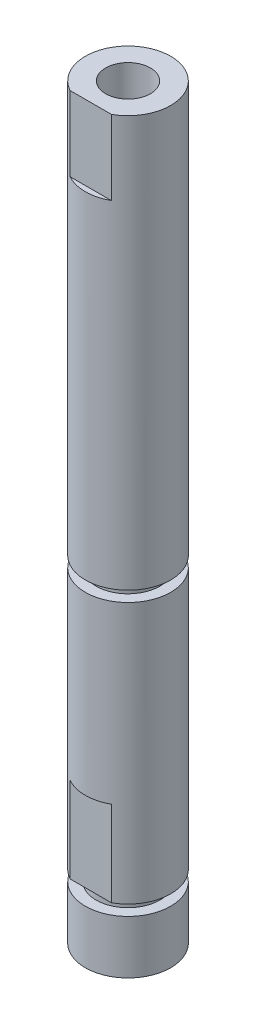
ISO-10303-21;
HEADER;
FILE_DESCRIPTION(('STEP AP214'),'2;1');
FILE_NAME('part.step','',(''),(''),'','','');
FILE_SCHEMA(('AUTOMOTIVE_DESIGN { 1 0 10303 214 1 1 1 1 }'));
ENDSEC;
DATA;
#1=APPLICATION_CONTEXT('core data for automotive mechanical design processes');
#2=APPLICATION_PROTOCOL_DEFINITION('international standard','automotive_design',2000,#1);
#3=PRODUCT_CONTEXT('',#1,'mechanical');
#4=PRODUCT('Part','Part','',(#3));
#5=PRODUCT_RELATED_PRODUCT_CATEGORY('part','',(#4));
#6=PRODUCT_DEFINITION_FORMATION('','',#4);
#7=PRODUCT_DEFINITION_CONTEXT('part definition',#1,'design');
#8=PRODUCT_DEFINITION('design','',#6,#7);
#9=PRODUCT_DEFINITION_SHAPE('','',#8);
#10=(LENGTH_UNIT() NAMED_UNIT(*) SI_UNIT(.MILLI.,.METRE.));
#11=(NAMED_UNIT(*) PLANE_ANGLE_UNIT() SI_UNIT($,.RADIAN.));
#12=(NAMED_UNIT(*) SI_UNIT($,.STERADIAN.) SOLID_ANGLE_UNIT());
#13=UNCERTAINTY_MEASURE_WITH_UNIT(LENGTH_MEASURE(1.E-05),#10,'distance_accuracy_value','');
#14=(GEOMETRIC_REPRESENTATION_CONTEXT(3) GLOBAL_UNCERTAINTY_ASSIGNED_CONTEXT((#13)) GLOBAL_UNIT_ASSIGNED_CONTEXT((#10,
#11,#12)) REPRESENTATION_CONTEXT('',''));
#15=CARTESIAN_POINT('',(0.,0.,0.));
#16=DIRECTION('',(0.,0.,1.));
#17=DIRECTION('',(1.,0.,0.));
#18=AXIS2_PLACEMENT_3D('',#15,#16,#17);
#19=CARTESIAN_POINT('',(0.,35.,0.));
#20=DIRECTION('',(0.,1.,0.));
#21=DIRECTION('',(-1.,0.,0.));
#22=AXIS2_PLACEMENT_3D('',#19,#20,#21);
#23=PLANE('',#22);
#24=CARTESIAN_POINT('',(0.,35.,0.));
#25=DIRECTION('',(0.,1.,0.));
#26=DIRECTION('',(0.,0.,1.));
#27=AXIS2_PLACEMENT_3D('',#24,#25,#26);
#28=CIRCLE('',#27,2.09999999999999);
#29=CARTESIAN_POINT('',(0.,35.,2.09999999999999));
#30=VERTEX_POINT('',#29);
#31=EDGE_CURVE('E91',#30,#30,#28,.T.);
#32=ORIENTED_EDGE('',*,*,#31,.F.);
#33=EDGE_LOOP('',(#32));
#34=FACE_BOUND('',#33,.T.);
#35=DIRECTION('',(1.,0.,0.));
#36=VECTOR('',#35,1.);
#37=CARTESIAN_POINT('',(-4.00000000000002,35.,3.50000000000002));
#38=LINE('',#37,#36);
#39=CARTESIAN_POINT('',(-1.93649167310373,35.,3.50000000000002));
#40=VERTEX_POINT('',#39);
#41=CARTESIAN_POINT('',(1.93649167310371,35.,3.50000000000002));
#42=VERTEX_POINT('',#41);
#43=EDGE_CURVE('E93',#40,#42,#38,.T.);
#44=ORIENTED_EDGE('',*,*,#43,.T.);
#45=CARTESIAN_POINT('',(0.,35.,0.));
#46=DIRECTION('',(0.,-1.,0.));
#47=DIRECTION('',(1.,0.,0.));
#48=AXIS2_PLACEMENT_3D('',#45,#46,#47);
#49=CIRCLE('',#48,4.00000000000001);
#50=EDGE_CURVE('E133',#40,#42,#49,.T.);
#51=ORIENTED_EDGE('',*,*,#50,.F.);
#52=EDGE_LOOP('',(#44,#51));
#53=FACE_BOUND('',#52,.T.);
#54=ADVANCED_FACE('F39',(#34,#53),#23,.T.);
#55=CARTESIAN_POINT('',(0.,-35.,0.));
#56=DIRECTION('',(0.,-1.,0.));
#57=DIRECTION('',(1.,0.,0.));
#58=AXIS2_PLACEMENT_3D('',#55,#56,#57);
#59=CYLINDRICAL_SURFACE('',#58,4.00000000000001);
#60=DIRECTION('',(0.,-1.,0.));
#61=VECTOR('',#60,1.);
#62=CARTESIAN_POINT('',(1.93649167310372,-35.,3.5));
#63=LINE('',#62,#61);
#64=CARTESIAN_POINT('',(1.93649167310369,28.,3.50000000000002));
#65=VERTEX_POINT('',#64);
#66=EDGE_CURVE('E11',#65,#42,#63,.F.);
#67=ORIENTED_EDGE('',*,*,#66,.F.);
#68=CARTESIAN_POINT('',(0.,28.,0.));
#69=DIRECTION('',(0.,-1.,0.));
#70=DIRECTION('',(0.,0.,-1.));
#71=AXIS2_PLACEMENT_3D('',#68,#69,#70);
#72=CIRCLE('',#71,4.00000000000001);
#73=CARTESIAN_POINT('',(-1.93649167310371,28.,3.50000000000002));
#74=VERTEX_POINT('',#73);
#75=EDGE_CURVE('E140',#74,#65,#72,.F.);
#76=ORIENTED_EDGE('',*,*,#75,.F.);
#77=DIRECTION('',(0.,-1.,0.));
#78=VECTOR('',#77,1.);
#79=CARTESIAN_POINT('',(-1.93649167310372,-35.,3.5));
#80=LINE('',#79,#78);
#81=EDGE_CURVE('E46',#40,#74,#80,.T.);
#82=ORIENTED_EDGE('',*,*,#81,.F.);
#83=ORIENTED_EDGE('',*,*,#50,.T.);
#84=EDGE_LOOP('',(#67,#76,#82,#83));
#85=FACE_BOUND('',#84,.T.);
#86=CARTESIAN_POINT('',(0.,-3.52,0.));
#87=DIRECTION('',(0.,-1.,0.));
#88=DIRECTION('',(1.,0.,0.));
#89=AXIS2_PLACEMENT_3D('',#86,#87,#88);
#90=CIRCLE('',#89,4.00000000000001);
#91=CARTESIAN_POINT('',(4.00000000000001,-3.52,0.));
#92=VERTEX_POINT('',#91);
#93=EDGE_CURVE('E130',#92,#92,#90,.T.);
#94=ORIENTED_EDGE('',*,*,#93,.F.);
#95=EDGE_LOOP('',(#94));
#96=FACE_BOUND('',#95,.T.);
#97=ADVANCED_FACE('F148',(#85,#96),#59,.T.);
#98=CARTESIAN_POINT('',(4.00000000000001,-3.52,0.));
#99=DIRECTION('',(0.,-1.,0.));
#100=DIRECTION('',(1.,0.,0.));
#101=AXIS2_PLACEMENT_3D('',#98,#99,#100);
#102=PLANE('',#101);
#103=ORIENTED_EDGE('',*,*,#93,.T.);
#104=EDGE_LOOP('',(#103));
#105=FACE_BOUND('',#104,.T.);
#106=CARTESIAN_POINT('',(0.,-3.52,0.));
#107=DIRECTION('',(0.,-1.,0.));
#108=DIRECTION('',(1.,0.,0.));
#109=AXIS2_PLACEMENT_3D('',#106,#107,#108);
#110=CIRCLE('',#109,3.);
#111=CARTESIAN_POINT('',(3.,-3.52,0.));
#112=VERTEX_POINT('',#111);
#113=EDGE_CURVE('E127',#112,#112,#110,.T.);
#114=ORIENTED_EDGE('',*,*,#113,.F.);
#115=EDGE_LOOP('',(#114));
#116=FACE_BOUND('',#115,.T.);
#117=ADVANCED_FACE('F156',(#105,#116),#102,.T.);
#118=CARTESIAN_POINT('',(0.,-35.,0.));
#119=DIRECTION('',(0.,-1.,0.));
#120=DIRECTION('',(1.,0.,0.));
#121=AXIS2_PLACEMENT_3D('',#118,#119,#120);
#122=CYLINDRICAL_SURFACE('',#121,3.00000000000001);
#123=ORIENTED_EDGE('',*,*,#113,.T.);
#124=EDGE_LOOP('',(#123));
#125=FACE_BOUND('',#124,.T.);
#126=CARTESIAN_POINT('',(0.,-4.52,0.));
#127=DIRECTION('',(0.,-1.,0.));
#128=DIRECTION('',(1.,0.,0.));
#129=AXIS2_PLACEMENT_3D('',#126,#127,#128);
#130=CIRCLE('',#129,3.00000000000001);
#131=CARTESIAN_POINT('',(3.,-4.52,0.));
#132=VERTEX_POINT('',#131);
#133=EDGE_CURVE('E124',#132,#132,#130,.T.);
#134=ORIENTED_EDGE('',*,*,#133,.F.);
#135=EDGE_LOOP('',(#134));
#136=FACE_BOUND('',#135,.T.);
#137=ADVANCED_FACE('F202',(#125,#136),#122,.T.);
#138=CARTESIAN_POINT('',(3.,-4.52,0.));
#139=DIRECTION('',(0.,1.,0.));
#140=DIRECTION('',(-1.,0.,0.));
#141=AXIS2_PLACEMENT_3D('',#138,#139,#140);
#142=PLANE('',#141);
#143=ORIENTED_EDGE('',*,*,#133,.T.);
#144=EDGE_LOOP('',(#143));
#145=FACE_BOUND('',#144,.T.);
#146=CARTESIAN_POINT('',(0.,-4.52,0.));
#147=DIRECTION('',(0.,-1.,0.));
#148=DIRECTION('',(1.,0.,0.));
#149=AXIS2_PLACEMENT_3D('',#146,#147,#148);
#150=CIRCLE('',#149,4.00000000000001);
#151=CARTESIAN_POINT('',(4.00000000000001,-4.52,0.));
#152=VERTEX_POINT('',#151);
#153=EDGE_CURVE('E121',#152,#152,#150,.T.);
#154=ORIENTED_EDGE('',*,*,#153,.F.);
#155=EDGE_LOOP('',(#154));
#156=FACE_BOUND('',#155,.T.);
#157=ADVANCED_FACE('F198',(#145,#156),#142,.T.);
#158=CARTESIAN_POINT('',(0.,-35.,0.));
#159=DIRECTION('',(0.,-1.,0.));
#160=DIRECTION('',(1.,0.,0.));
#161=AXIS2_PLACEMENT_3D('',#158,#159,#160);
#162=CYLINDRICAL_SURFACE('',#161,4.00000000000001);
#163=CARTESIAN_POINT('',(0.,-21.,0.));
#164=DIRECTION('',(0.,1.,0.));
#165=DIRECTION('',(0.,0.,1.));
#166=AXIS2_PLACEMENT_3D('',#163,#164,#165);
#167=CIRCLE('',#166,4.00000000000001);
#168=CARTESIAN_POINT('',(1.93649167310371,-21.,3.50000000000001));
#169=VERTEX_POINT('',#168);
#170=CARTESIAN_POINT('',(-1.93649167310372,-21.,3.50000000000001));
#171=VERTEX_POINT('',#170);
#172=EDGE_CURVE('E138',#169,#171,#167,.F.);
#173=ORIENTED_EDGE('',*,*,#172,.F.);
#174=DIRECTION('',(0.,-1.,0.));
#175=VECTOR('',#174,1.);
#176=CARTESIAN_POINT('',(1.93649167310371,-35.,3.50000000000001));
#177=LINE('',#176,#175);
#178=CARTESIAN_POINT('',(1.93649167310371,-29.,3.50000000000001));
#179=VERTEX_POINT('',#178);
#180=EDGE_CURVE('E103',#179,#169,#177,.F.);
#181=ORIENTED_EDGE('',*,*,#180,.F.);
#182=CARTESIAN_POINT('',(0.,-29.,0.));
#183=DIRECTION('',(0.,-1.,0.));
#184=DIRECTION('',(1.,0.,0.));
#185=AXIS2_PLACEMENT_3D('',#182,#183,#184);
#186=CIRCLE('',#185,4.00000000000001);
#187=CARTESIAN_POINT('',(-1.93649167310371,-29.,3.50000000000001));
#188=VERTEX_POINT('',#187);
#189=EDGE_CURVE('E118',#188,#179,#186,.T.);
#190=ORIENTED_EDGE('',*,*,#189,.F.);
#191=DIRECTION('',(0.,-1.,0.));
#192=VECTOR('',#191,1.);
#193=CARTESIAN_POINT('',(-1.93649167310371,-35.,3.50000000000001));
#194=LINE('',#193,#192);
#195=EDGE_CURVE('E53',#171,#188,#194,.T.);
#196=ORIENTED_EDGE('',*,*,#195,.F.);
#197=EDGE_LOOP('',(#173,#181,#190,#196));
#198=FACE_BOUND('',#197,.T.);
#199=ORIENTED_EDGE('',*,*,#153,.T.);
#200=EDGE_LOOP('',(#199));
#201=FACE_BOUND('',#200,.T.);
#202=ADVANCED_FACE('F194',(#198,#201),#162,.T.);
#203=CARTESIAN_POINT('',(4.00000000000001,-29.,0.));
#204=DIRECTION('',(0.,-1.,0.));
#205=DIRECTION('',(1.,0.,0.));
#206=AXIS2_PLACEMENT_3D('',#203,#204,#205);
#207=PLANE('',#206);
#208=DIRECTION('',(1.,0.,0.));
#209=VECTOR('',#208,1.);
#210=CARTESIAN_POINT('',(4.00000000000001,-29.,3.50000000000001));
#211=LINE('',#210,#209);
#212=EDGE_CURVE('E136',#188,#179,#211,.T.);
#213=ORIENTED_EDGE('',*,*,#212,.F.);
#214=ORIENTED_EDGE('',*,*,#189,.T.);
#215=EDGE_LOOP('',(#213,#214));
#216=FACE_BOUND('',#215,.T.);
#217=CARTESIAN_POINT('',(0.,-29.,0.));
#218=DIRECTION('',(0.,-1.,0.));
#219=DIRECTION('',(1.,0.,0.));
#220=AXIS2_PLACEMENT_3D('',#217,#218,#219);
#221=CIRCLE('',#220,3.);
#222=CARTESIAN_POINT('',(3.,-29.,0.));
#223=VERTEX_POINT('',#222);
#224=EDGE_CURVE('E115',#223,#223,#221,.T.);
#225=ORIENTED_EDGE('',*,*,#224,.F.);
#226=EDGE_LOOP('',(#225));
#227=FACE_BOUND('',#226,.T.);
#228=ADVANCED_FACE('F190',(#216,#227),#207,.T.);
#229=CARTESIAN_POINT('',(0.,-35.,0.));
#230=DIRECTION('',(0.,-1.,0.));
#231=DIRECTION('',(1.,0.,0.));
#232=AXIS2_PLACEMENT_3D('',#229,#230,#231);
#233=CYLINDRICAL_SURFACE('',#232,3.);
#234=ORIENTED_EDGE('',*,*,#224,.T.);
#235=EDGE_LOOP('',(#234));
#236=FACE_BOUND('',#235,.T.);
#237=CARTESIAN_POINT('',(0.,-30.,0.));
#238=DIRECTION('',(0.,-1.,0.));
#239=DIRECTION('',(1.,0.,0.));
#240=AXIS2_PLACEMENT_3D('',#237,#238,#239);
#241=CIRCLE('',#240,3.);
#242=CARTESIAN_POINT('',(3.,-30.,0.));
#243=VERTEX_POINT('',#242);
#244=EDGE_CURVE('E112',#243,#243,#241,.T.);
#245=ORIENTED_EDGE('',*,*,#244,.F.);
#246=EDGE_LOOP('',(#245));
#247=FACE_BOUND('',#246,.T.);
#248=ADVANCED_FACE('F186',(#236,#247),#233,.T.);
#249=CARTESIAN_POINT('',(3.,-30.,0.));
#250=DIRECTION('',(0.,1.,0.));
#251=DIRECTION('',(-1.,0.,0.));
#252=AXIS2_PLACEMENT_3D('',#249,#250,#251);
#253=PLANE('',#252);
#254=ORIENTED_EDGE('',*,*,#244,.T.);
#255=EDGE_LOOP('',(#254));
#256=FACE_BOUND('',#255,.T.);
#257=CARTESIAN_POINT('',(0.,-30.,0.));
#258=DIRECTION('',(0.,-1.,0.));
#259=DIRECTION('',(1.,0.,0.));
#260=AXIS2_PLACEMENT_3D('',#257,#258,#259);
#261=CIRCLE('',#260,4.00000000000001);
#262=CARTESIAN_POINT('',(4.00000000000001,-30.,0.));
#263=VERTEX_POINT('',#262);
#264=EDGE_CURVE('E109',#263,#263,#261,.T.);
#265=ORIENTED_EDGE('',*,*,#264,.F.);
#266=EDGE_LOOP('',(#265));
#267=FACE_BOUND('',#266,.T.);
#268=ADVANCED_FACE('F182',(#256,#267),#253,.T.);
#269=CARTESIAN_POINT('',(0.,-35.,0.));
#270=DIRECTION('',(0.,-1.,0.));
#271=DIRECTION('',(1.,0.,0.));
#272=AXIS2_PLACEMENT_3D('',#269,#270,#271);
#273=CYLINDRICAL_SURFACE('',#272,4.00000000000001);
#274=ORIENTED_EDGE('',*,*,#264,.T.);
#275=EDGE_LOOP('',(#274));
#276=FACE_BOUND('',#275,.T.);
#277=CARTESIAN_POINT('',(0.,-35.,0.));
#278=DIRECTION('',(0.,-1.,0.));
#279=DIRECTION('',(1.,0.,0.));
#280=AXIS2_PLACEMENT_3D('',#277,#278,#279);
#281=CIRCLE('',#280,4.00000000000001);
#282=CARTESIAN_POINT('',(4.00000000000001,-35.,0.));
#283=VERTEX_POINT('',#282);
#284=EDGE_CURVE('E106',#283,#283,#281,.T.);
#285=ORIENTED_EDGE('',*,*,#284,.F.);
#286=EDGE_LOOP('',(#285));
#287=FACE_BOUND('',#286,.T.);
#288=ADVANCED_FACE('F178',(#276,#287),#273,.T.);
#289=CARTESIAN_POINT('',(4.00000000000001,-35.,0.));
#290=DIRECTION('',(0.,-1.,0.));
#291=DIRECTION('',(1.,0.,0.));
#292=AXIS2_PLACEMENT_3D('',#289,#290,#291);
#293=PLANE('',#292);
#294=ORIENTED_EDGE('',*,*,#284,.T.);
#295=EDGE_LOOP('',(#294));
#296=FACE_BOUND('',#295,.T.);
#297=ADVANCED_FACE('F168',(#296),#293,.T.);
#298=CARTESIAN_POINT('',(-4.00000000000002,-21.,4.00000000000001));
#299=DIRECTION('',(0.,1.,0.));
#300=DIRECTION('',(0.,0.,1.));
#301=AXIS2_PLACEMENT_3D('',#298,#299,#300);
#302=PLANE('',#301);
#303=ORIENTED_EDGE('',*,*,#172,.T.);
#304=DIRECTION('',(1.,0.,0.));
#305=VECTOR('',#304,1.);
#306=CARTESIAN_POINT('',(-4.00000000000002,-21.,3.50000000000001));
#307=LINE('',#306,#305);
#308=EDGE_CURVE('E98',#171,#169,#307,.T.);
#309=ORIENTED_EDGE('',*,*,#308,.T.);
#310=EDGE_LOOP('',(#303,#309));
#311=FACE_BOUND('',#310,.T.);
#312=ADVANCED_FACE('F164',(#311),#302,.F.);
#313=CARTESIAN_POINT('',(-4.00000000000002,-21.,3.50000000000001));
#314=DIRECTION('',(0.,0.,-1.));
#315=DIRECTION('',(0.,1.,0.));
#316=AXIS2_PLACEMENT_3D('',#313,#314,#315);
#317=PLANE('',#316);
#318=ORIENTED_EDGE('',*,*,#180,.T.);
#319=ORIENTED_EDGE('',*,*,#308,.F.);
#320=ORIENTED_EDGE('',*,*,#195,.T.);
#321=ORIENTED_EDGE('',*,*,#212,.T.);
#322=EDGE_LOOP('',(#318,#319,#320,#321));
#323=FACE_BOUND('',#322,.T.);
#324=ADVANCED_FACE('F167',(#323),#317,.F.);
#325=CARTESIAN_POINT('',(-4.00000000000002,35.,3.50000000000002));
#326=DIRECTION('',(0.,0.,-1.));
#327=DIRECTION('',(0.,1.,0.));
#328=AXIS2_PLACEMENT_3D('',#325,#326,#327);
#329=PLANE('',#328);
#330=ORIENTED_EDGE('',*,*,#66,.T.);
#331=ORIENTED_EDGE('',*,*,#43,.F.);
#332=ORIENTED_EDGE('',*,*,#81,.T.);
#333=DIRECTION('',(1.,0.,0.));
#334=VECTOR('',#333,1.);
#335=CARTESIAN_POINT('',(-4.00000000000002,28.,3.50000000000002));
#336=LINE('',#335,#334);
#337=EDGE_CURVE('E90',#74,#65,#336,.T.);
#338=ORIENTED_EDGE('',*,*,#337,.T.);
#339=EDGE_LOOP('',(#330,#331,#332,#338));
#340=FACE_BOUND('',#339,.T.);
#341=ADVANCED_FACE('F144',(#340),#329,.F.);
#342=CARTESIAN_POINT('',(-4.00000000000002,28.,4.00000000000001));
#343=DIRECTION('',(0.,-1.,0.));
#344=DIRECTION('',(0.,0.,-1.));
#345=AXIS2_PLACEMENT_3D('',#342,#343,#344);
#346=PLANE('',#345);
#347=ORIENTED_EDGE('',*,*,#337,.F.);
#348=ORIENTED_EDGE('',*,*,#75,.T.);
#349=EDGE_LOOP('',(#347,#348));
#350=FACE_BOUND('',#349,.T.);
#351=ADVANCED_FACE('F84',(#350),#346,.F.);
#352=CARTESIAN_POINT('',(0.,27.,0.));
#353=DIRECTION('',(0.,1.,0.));
#354=DIRECTION('',(0.,0.,1.));
#355=AXIS2_PLACEMENT_3D('',#352,#353,#354);
#356=CONICAL_SURFACE('',#355,2.1,1.02974425867665);
#357=CARTESIAN_POINT('',(0.,25.7381927000421,0.));
#358=VERTEX_POINT('',#357);
#359=VERTEX_LOOP('',#358);
#360=FACE_BOUND('',#359,.T.);
#361=CARTESIAN_POINT('',(0.,27.,0.));
#362=DIRECTION('',(0.,1.,0.));
#363=DIRECTION('',(0.,0.,1.));
#364=AXIS2_PLACEMENT_3D('',#361,#362,#363);
#365=CIRCLE('',#364,2.1);
#366=CARTESIAN_POINT('',(0.,27.,2.1));
#367=VERTEX_POINT('',#366);
#368=EDGE_CURVE('E88',#367,#367,#365,.T.);
#369=ORIENTED_EDGE('',*,*,#368,.T.);
#370=EDGE_LOOP('',(#369));
#371=FACE_BOUND('',#370,.T.);
#372=ADVANCED_FACE('F80',(#360,#371),#356,.F.);
#373=CARTESIAN_POINT('',(0.,35.,0.));
#374=DIRECTION('',(0.,1.,0.));
#375=DIRECTION('',(0.,0.,1.));
#376=AXIS2_PLACEMENT_3D('',#373,#374,#375);
#377=CYLINDRICAL_SURFACE('',#376,2.09999999999999);
#378=ORIENTED_EDGE('',*,*,#368,.F.);
#379=EDGE_LOOP('',(#378));
#380=FACE_BOUND('',#379,.T.);
#381=ORIENTED_EDGE('',*,*,#31,.T.);
#382=EDGE_LOOP('',(#381));
#383=FACE_BOUND('',#382,.T.);
#384=ADVANCED_FACE('F83',(#380,#383),#377,.F.);
#385=CLOSED_SHELL('',(#54,#97,#117,#137,#157,#202,#228,#248,#268,#288,#297,#312,#324,#341,#351,
#372,#384));
#386=MANIFOLD_SOLID_BREP('B2',#385);
#387=ADVANCED_BREP_SHAPE_REPRESENTATION('',(#18,#386),#14);
#388=SHAPE_DEFINITION_REPRESENTATION(#9,#387);
ENDSEC;
END-ISO-10303-21;
